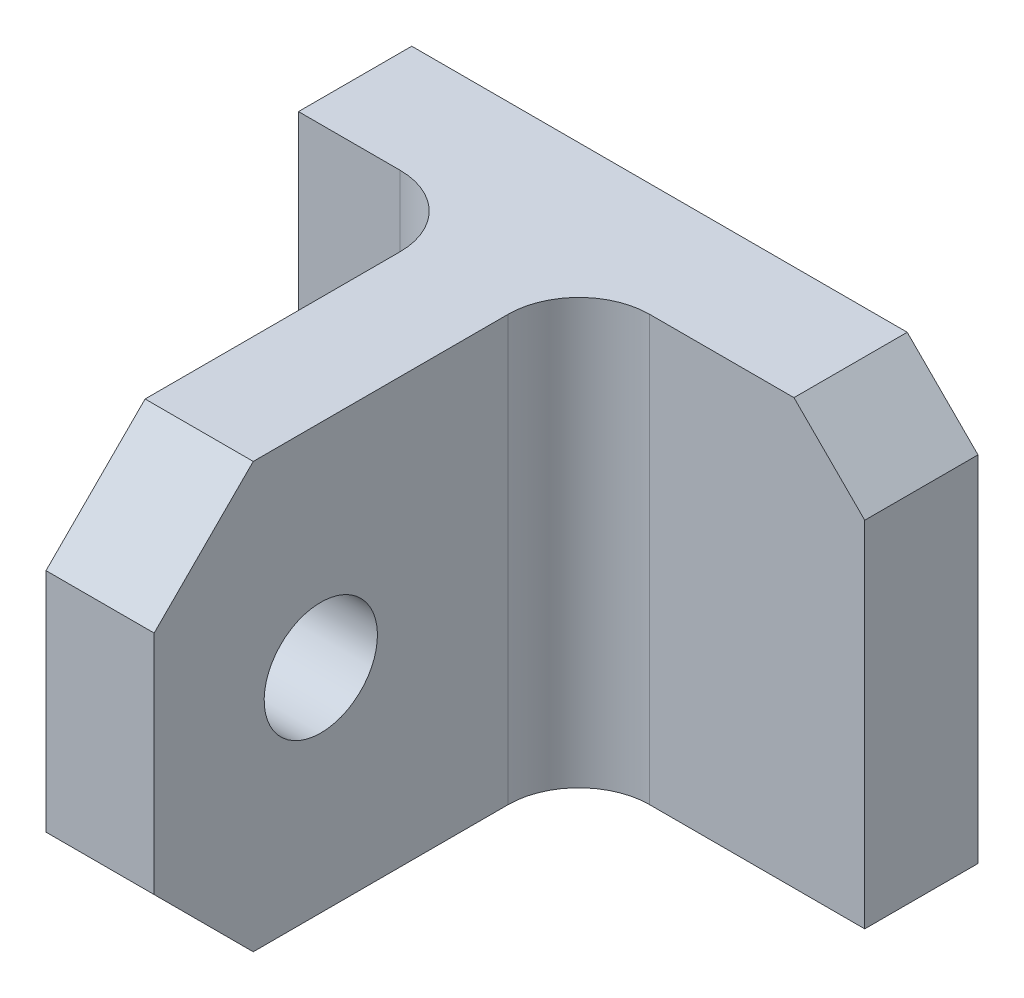
ISO-10303-21;
HEADER;
FILE_DESCRIPTION(('STEP AP214'),'2;1');
FILE_NAME('part.step','',(''),(''),'','','');
FILE_SCHEMA(('AUTOMOTIVE_DESIGN { 1 0 10303 214 1 1 1 1 }'));
ENDSEC;
DATA;
#1=APPLICATION_CONTEXT('core data for automotive mechanical design processes');
#2=APPLICATION_PROTOCOL_DEFINITION('international standard','automotive_design',2000,#1);
#3=PRODUCT_CONTEXT('',#1,'mechanical');
#4=PRODUCT('Part','Part','',(#3));
#5=PRODUCT_RELATED_PRODUCT_CATEGORY('part','',(#4));
#6=PRODUCT_DEFINITION_FORMATION('','',#4);
#7=PRODUCT_DEFINITION_CONTEXT('part definition',#1,'design');
#8=PRODUCT_DEFINITION('design','',#6,#7);
#9=PRODUCT_DEFINITION_SHAPE('','',#8);
#10=(LENGTH_UNIT() NAMED_UNIT(*) SI_UNIT(.MILLI.,.METRE.));
#11=(NAMED_UNIT(*) PLANE_ANGLE_UNIT() SI_UNIT($,.RADIAN.));
#12=(NAMED_UNIT(*) SI_UNIT($,.STERADIAN.) SOLID_ANGLE_UNIT());
#13=UNCERTAINTY_MEASURE_WITH_UNIT(LENGTH_MEASURE(1.E-05),#10,'distance_accuracy_value','');
#14=(GEOMETRIC_REPRESENTATION_CONTEXT(3) GLOBAL_UNCERTAINTY_ASSIGNED_CONTEXT((#13)) GLOBAL_UNIT_ASSIGNED_CONTEXT((#10,
#11,#12)) REPRESENTATION_CONTEXT('',''));
#15=CARTESIAN_POINT('',(0.,0.,0.));
#16=DIRECTION('',(0.,0.,1.));
#17=DIRECTION('',(1.,0.,0.));
#18=AXIS2_PLACEMENT_3D('',#15,#16,#17);
#19=CARTESIAN_POINT('',(-4.01563817115146,0.,30.));
#20=DIRECTION('',(1.,0.,0.));
#21=DIRECTION('',(0.,1.,0.));
#22=AXIS2_PLACEMENT_3D('',#19,#20,#21);
#23=PLANE('',#22);
#24=CARTESIAN_POINT('',(-4.01563817115146,-15.,18.2288416886326));
#25=DIRECTION('',(-1.,0.,0.));
#26=DIRECTION('',(0.,-1.,0.));
#27=AXIS2_PLACEMENT_3D('',#24,#25,#26);
#28=CIRCLE('',#27,4.);
#29=CARTESIAN_POINT('',(-4.01563817115146,-19.,18.2288416886326));
#30=VERTEX_POINT('',#29);
#31=EDGE_CURVE('E189',#30,#30,#28,.T.);
#32=ORIENTED_EDGE('',*,*,#31,.F.);
#33=EDGE_LOOP('',(#32));
#34=FACE_BOUND('',#33,.T.);
#35=DIRECTION('',(0.,0.,-1.));
#36=VECTOR('',#35,1.);
#37=CARTESIAN_POINT('',(-4.01563817115146,-30.,30.));
#38=LINE('',#37,#36);
#39=CARTESIAN_POINT('',(-4.01563817115146,-30.,23.));
#40=VERTEX_POINT('',#39);
#41=CARTESIAN_POINT('',(-4.01563817115146,-30.,5.));
#42=VERTEX_POINT('',#41);
#43=EDGE_CURVE('E229',#40,#42,#38,.T.);
#44=ORIENTED_EDGE('',*,*,#43,.F.);
#45=DIRECTION('',(0.,0.707106781186546,0.707106781186549));
#46=VECTOR('',#45,1.);
#47=CARTESIAN_POINT('',(-4.01563817115146,-23.,30.));
#48=LINE('',#47,#46);
#49=CARTESIAN_POINT('',(-4.01563817115146,-23.,30.));
#50=VERTEX_POINT('',#49);
#51=EDGE_CURVE('E207',#40,#50,#48,.T.);
#52=ORIENTED_EDGE('',*,*,#51,.T.);
#53=DIRECTION('',(0.,-1.,0.));
#54=VECTOR('',#53,1.);
#55=CARTESIAN_POINT('',(-4.01563817115146,0.,30.));
#56=LINE('',#55,#54);
#57=CARTESIAN_POINT('',(-4.01563817115146,-6.99999999999999,30.));
#58=VERTEX_POINT('',#57);
#59=EDGE_CURVE('E147',#58,#50,#56,.T.);
#60=ORIENTED_EDGE('',*,*,#59,.F.);
#61=DIRECTION('',(0.,0.707106781186546,-0.707106781186549));
#62=VECTOR('',#61,1.);
#63=CARTESIAN_POINT('',(-4.01563817115146,-7.,30.));
#64=LINE('',#63,#62);
#65=CARTESIAN_POINT('',(-4.01563817115146,0.,23.));
#66=VERTEX_POINT('',#65);
#67=EDGE_CURVE('E211',#58,#66,#64,.T.);
#68=ORIENTED_EDGE('',*,*,#67,.T.);
#69=DIRECTION('',(0.,0.,-1.));
#70=VECTOR('',#69,1.);
#71=CARTESIAN_POINT('',(-4.01563817115146,0.,30.));
#72=LINE('',#71,#70);
#73=CARTESIAN_POINT('',(-4.01563817115146,0.,5.));
#74=VERTEX_POINT('',#73);
#75=EDGE_CURVE('E219',#66,#74,#72,.T.);
#76=ORIENTED_EDGE('',*,*,#75,.T.);
#77=DIRECTION('',(0.,-1.,0.));
#78=VECTOR('',#77,1.);
#79=CARTESIAN_POINT('',(-4.01563817115146,0.,5.));
#80=LINE('',#79,#78);
#81=EDGE_CURVE('E171',#74,#42,#80,.T.);
#82=ORIENTED_EDGE('',*,*,#81,.T.);
#83=EDGE_LOOP('',(#44,#52,#60,#68,#76,#82));
#84=FACE_BOUND('',#83,.T.);
#85=ADVANCED_FACE('F31',(#34,#84),#23,.F.);
#86=CARTESIAN_POINT('',(-4.01563817115146,-30.,30.));
#87=DIRECTION('',(0.,1.,0.));
#88=DIRECTION('',(0.,0.,1.));
#89=AXIS2_PLACEMENT_3D('',#86,#87,#88);
#90=PLANE('',#89);
#91=DIRECTION('',(0.,0.,-1.));
#92=VECTOR('',#91,1.);
#93=CARTESIAN_POINT('',(3.62436182884854,-30.,30.));
#94=LINE('',#93,#92);
#95=CARTESIAN_POINT('',(3.62436182884854,-30.,23.));
#96=VERTEX_POINT('',#95);
#97=CARTESIAN_POINT('',(3.62436182884854,-30.,5.));
#98=VERTEX_POINT('',#97);
#99=EDGE_CURVE('E231',#96,#98,#94,.T.);
#100=ORIENTED_EDGE('',*,*,#99,.F.);
#101=DIRECTION('',(-1.,0.,0.));
#102=VECTOR('',#101,1.);
#103=CARTESIAN_POINT('',(-4.01563817115146,-30.,23.));
#104=LINE('',#103,#102);
#105=EDGE_CURVE('E216',#96,#40,#104,.T.);
#106=ORIENTED_EDGE('',*,*,#105,.T.);
#107=ORIENTED_EDGE('',*,*,#43,.T.);
#108=CARTESIAN_POINT('',(-9.01563817115146,-30.,5.));
#109=DIRECTION('',(0.,1.,0.));
#110=DIRECTION('',(0.,0.,1.));
#111=AXIS2_PLACEMENT_3D('',#108,#109,#110);
#112=CIRCLE('',#111,5.);
#113=CARTESIAN_POINT('',(-9.01563817115146,-29.9999999923037,0.));
#114=VERTEX_POINT('',#113);
#115=EDGE_CURVE('E263',#42,#114,#112,.T.);
#116=ORIENTED_EDGE('',*,*,#115,.T.);
#117=DIRECTION('',(-1.,0.,0.));
#118=VECTOR('',#117,1.);
#119=CARTESIAN_POINT('',(23.82,-29.9999999923037,0.));
#120=LINE('',#119,#118);
#121=CARTESIAN_POINT('',(-16.18,-29.9999999923037,0.));
#122=VERTEX_POINT('',#121);
#123=EDGE_CURVE('E161',#114,#122,#120,.T.);
#124=ORIENTED_EDGE('',*,*,#123,.T.);
#125=DIRECTION('',(0.,0.,1.));
#126=VECTOR('',#125,1.);
#127=CARTESIAN_POINT('',(-16.18,-29.9999999923037,-8.));
#128=LINE('',#127,#126);
#129=CARTESIAN_POINT('',(-16.18,-29.9999999923037,-8.));
#130=VERTEX_POINT('',#129);
#131=EDGE_CURVE('E154',#130,#122,#128,.T.);
#132=ORIENTED_EDGE('',*,*,#131,.F.);
#133=DIRECTION('',(-1.,0.,0.));
#134=VECTOR('',#133,1.);
#135=CARTESIAN_POINT('',(23.82,-29.9999999923037,-8.));
#136=LINE('',#135,#134);
#137=CARTESIAN_POINT('',(23.82,-29.9999999923037,-8.));
#138=VERTEX_POINT('',#137);
#139=EDGE_CURVE('E138',#138,#130,#136,.T.);
#140=ORIENTED_EDGE('',*,*,#139,.F.);
#141=DIRECTION('',(0.,0.,1.));
#142=VECTOR('',#141,1.);
#143=CARTESIAN_POINT('',(23.82,-29.9999999923037,-8.));
#144=LINE('',#143,#142);
#145=CARTESIAN_POINT('',(23.82,-29.9999999923037,0.));
#146=VERTEX_POINT('',#145);
#147=EDGE_CURVE('E148',#138,#146,#144,.T.);
#148=ORIENTED_EDGE('',*,*,#147,.T.);
#149=CARTESIAN_POINT('',(8.62436182884854,-29.9999999923037,0.));
#150=VERTEX_POINT('',#149);
#151=EDGE_CURVE('E142',#146,#150,#120,.T.);
#152=ORIENTED_EDGE('',*,*,#151,.T.);
#153=CARTESIAN_POINT('',(8.62436182884854,-30.,5.));
#154=DIRECTION('',(0.,1.,0.));
#155=DIRECTION('',(0.,0.,1.));
#156=AXIS2_PLACEMENT_3D('',#153,#154,#155);
#157=CIRCLE('',#156,5.);
#158=EDGE_CURVE('E254',#150,#98,#157,.T.);
#159=ORIENTED_EDGE('',*,*,#158,.T.);
#160=EDGE_LOOP('',(#100,#106,#107,#116,#124,#132,#140,#148,#152,#159));
#161=FACE_BOUND('',#160,.T.);
#162=ADVANCED_FACE('F274',(#161),#90,.F.);
#163=CARTESIAN_POINT('',(3.62436182884854,0.,30.));
#164=DIRECTION('',(-1.,0.,0.));
#165=DIRECTION('',(0.,-1.,0.));
#166=AXIS2_PLACEMENT_3D('',#163,#164,#165);
#167=PLANE('',#166);
#168=CARTESIAN_POINT('',(3.62436182884853,-15.,18.2288416886326));
#169=DIRECTION('',(-1.,0.,0.));
#170=DIRECTION('',(0.,-1.,0.));
#171=AXIS2_PLACEMENT_3D('',#168,#169,#170);
#172=CIRCLE('',#171,4.);
#173=CARTESIAN_POINT('',(3.62436182884854,-19.,18.2288416886326));
#174=VERTEX_POINT('',#173);
#175=EDGE_CURVE('E186',#174,#174,#172,.T.);
#176=ORIENTED_EDGE('',*,*,#175,.T.);
#177=EDGE_LOOP('',(#176));
#178=FACE_BOUND('',#177,.T.);
#179=DIRECTION('',(0.,1.,0.));
#180=VECTOR('',#179,1.);
#181=CARTESIAN_POINT('',(3.62436182884854,0.,30.));
#182=LINE('',#181,#180);
#183=CARTESIAN_POINT('',(3.62436182884854,-23.,30.));
#184=VERTEX_POINT('',#183);
#185=CARTESIAN_POINT('',(3.62436182884854,-6.99999999999999,30.));
#186=VERTEX_POINT('',#185);
#187=EDGE_CURVE('E151',#184,#186,#182,.T.);
#188=ORIENTED_EDGE('',*,*,#187,.F.);
#189=DIRECTION('',(0.,-0.707106781186546,-0.707106781186549));
#190=VECTOR('',#189,1.);
#191=CARTESIAN_POINT('',(3.62436182884854,-23.,30.));
#192=LINE('',#191,#190);
#193=EDGE_CURVE('E232',#184,#96,#192,.T.);
#194=ORIENTED_EDGE('',*,*,#193,.T.);
#195=ORIENTED_EDGE('',*,*,#99,.T.);
#196=DIRECTION('',(0.,1.,0.));
#197=VECTOR('',#196,1.);
#198=CARTESIAN_POINT('',(3.62436182884854,0.,5.));
#199=LINE('',#198,#197);
#200=CARTESIAN_POINT('',(3.62436182884854,0.,5.));
#201=VERTEX_POINT('',#200);
#202=EDGE_CURVE('E175',#98,#201,#199,.T.);
#203=ORIENTED_EDGE('',*,*,#202,.T.);
#204=DIRECTION('',(0.,0.,-1.));
#205=VECTOR('',#204,1.);
#206=CARTESIAN_POINT('',(3.62436182884854,0.,30.));
#207=LINE('',#206,#205);
#208=CARTESIAN_POINT('',(3.62436182884854,0.,23.));
#209=VERTEX_POINT('',#208);
#210=EDGE_CURVE('E221',#209,#201,#207,.T.);
#211=ORIENTED_EDGE('',*,*,#210,.F.);
#212=DIRECTION('',(0.,-0.707106781186546,0.707106781186549));
#213=VECTOR('',#212,1.);
#214=CARTESIAN_POINT('',(3.62436182884854,-6.99999999999999,30.));
#215=LINE('',#214,#213);
#216=EDGE_CURVE('E234',#209,#186,#215,.T.);
#217=ORIENTED_EDGE('',*,*,#216,.T.);
#218=EDGE_LOOP('',(#188,#194,#195,#203,#211,#217));
#219=FACE_BOUND('',#218,.T.);
#220=ADVANCED_FACE('F278',(#178,#219),#167,.F.);
#221=CARTESIAN_POINT('',(-4.01563817115146,0.,30.));
#222=DIRECTION('',(0.,-1.,0.));
#223=DIRECTION('',(0.,0.,-1.));
#224=AXIS2_PLACEMENT_3D('',#221,#222,#223);
#225=PLANE('',#224);
#226=DIRECTION('',(1.,0.,0.));
#227=VECTOR('',#226,1.);
#228=CARTESIAN_POINT('',(23.82,-6.81641941867636E-12,0.));
#229=LINE('',#228,#227);
#230=CARTESIAN_POINT('',(8.62436182884854,-6.81641941867636E-12,0.));
#231=VERTEX_POINT('',#230);
#232=CARTESIAN_POINT('',(18.8199999999931,-6.81641941867636E-12,0.));
#233=VERTEX_POINT('',#232);
#234=EDGE_CURVE('E179',#231,#233,#229,.T.);
#235=ORIENTED_EDGE('',*,*,#234,.T.);
#236=DIRECTION('',(0.,0.,-1.));
#237=VECTOR('',#236,1.);
#238=CARTESIAN_POINT('',(18.8199999999931,0.,30.));
#239=LINE('',#238,#237);
#240=CARTESIAN_POINT('',(18.82,-6.81607397789462E-12,-8.));
#241=VERTEX_POINT('',#240);
#242=EDGE_CURVE('E39',#233,#241,#239,.T.);
#243=ORIENTED_EDGE('',*,*,#242,.T.);
#244=DIRECTION('',(1.,0.,0.));
#245=VECTOR('',#244,1.);
#246=CARTESIAN_POINT('',(23.82,-6.81641941867636E-12,-8.));
#247=LINE('',#246,#245);
#248=CARTESIAN_POINT('',(-16.18,-6.81641941867636E-12,-8.));
#249=VERTEX_POINT('',#248);
#250=EDGE_CURVE('E123',#249,#241,#247,.T.);
#251=ORIENTED_EDGE('',*,*,#250,.F.);
#252=DIRECTION('',(0.,0.,1.));
#253=VECTOR('',#252,1.);
#254=CARTESIAN_POINT('',(-16.18,-6.81641941867636E-12,-8.));
#255=LINE('',#254,#253);
#256=CARTESIAN_POINT('',(-16.18,-6.81641941867636E-12,0.));
#257=VERTEX_POINT('',#256);
#258=EDGE_CURVE('E128',#249,#257,#255,.T.);
#259=ORIENTED_EDGE('',*,*,#258,.T.);
#260=CARTESIAN_POINT('',(-9.01563817115146,-6.81641941867636E-12,0.));
#261=VERTEX_POINT('',#260);
#262=EDGE_CURVE('E162',#257,#261,#229,.T.);
#263=ORIENTED_EDGE('',*,*,#262,.T.);
#264=CARTESIAN_POINT('',(-9.01563817115146,0.,5.));
#265=DIRECTION('',(0.,-1.,0.));
#266=DIRECTION('',(0.,0.,-1.));
#267=AXIS2_PLACEMENT_3D('',#264,#265,#266);
#268=CIRCLE('',#267,5.);
#269=EDGE_CURVE('E261',#261,#74,#268,.T.);
#270=ORIENTED_EDGE('',*,*,#269,.T.);
#271=ORIENTED_EDGE('',*,*,#75,.F.);
#272=DIRECTION('',(1.,0.,0.));
#273=VECTOR('',#272,1.);
#274=CARTESIAN_POINT('',(3.62436182884854,0.,23.));
#275=LINE('',#274,#273);
#276=EDGE_CURVE('E199',#66,#209,#275,.T.);
#277=ORIENTED_EDGE('',*,*,#276,.T.);
#278=ORIENTED_EDGE('',*,*,#210,.T.);
#279=CARTESIAN_POINT('',(8.62436182884854,0.,5.));
#280=DIRECTION('',(0.,-1.,0.));
#281=DIRECTION('',(0.,0.,-1.));
#282=AXIS2_PLACEMENT_3D('',#279,#280,#281);
#283=CIRCLE('',#282,5.);
#284=EDGE_CURVE('E257',#201,#231,#283,.T.);
#285=ORIENTED_EDGE('',*,*,#284,.T.);
#286=EDGE_LOOP('',(#235,#243,#251,#259,#263,#270,#271,#277,#278,#285));
#287=FACE_BOUND('',#286,.T.);
#288=ADVANCED_FACE('F125',(#287),#225,.F.);
#289=CARTESIAN_POINT('',(-4.01563817115146,-30.,30.));
#290=DIRECTION('',(0.,0.,1.));
#291=DIRECTION('',(1.,0.,0.));
#292=AXIS2_PLACEMENT_3D('',#289,#290,#291);
#293=PLANE('',#292);
#294=ORIENTED_EDGE('',*,*,#59,.T.);
#295=DIRECTION('',(1.,0.,0.));
#296=VECTOR('',#295,1.);
#297=CARTESIAN_POINT('',(3.62436182884854,-23.,30.));
#298=LINE('',#297,#296);
#299=EDGE_CURVE('E236',#50,#184,#298,.T.);
#300=ORIENTED_EDGE('',*,*,#299,.T.);
#301=ORIENTED_EDGE('',*,*,#187,.T.);
#302=DIRECTION('',(-1.,0.,0.));
#303=VECTOR('',#302,1.);
#304=CARTESIAN_POINT('',(-4.01563817115146,-7.,30.));
#305=LINE('',#304,#303);
#306=EDGE_CURVE('E248',#186,#58,#305,.T.);
#307=ORIENTED_EDGE('',*,*,#306,.T.);
#308=EDGE_LOOP('',(#294,#300,#301,#307));
#309=FACE_BOUND('',#308,.T.);
#310=ADVANCED_FACE('F247',(#309),#293,.T.);
#311=CARTESIAN_POINT('',(-16.18,-6.81641941867636E-12,0.));
#312=DIRECTION('',(0.,0.,1.));
#313=DIRECTION('',(1.,0.,0.));
#314=AXIS2_PLACEMENT_3D('',#311,#312,#313);
#315=PLANE('',#314);
#316=ORIENTED_EDGE('',*,*,#123,.F.);
#317=DIRECTION('',(0.,-1.,0.));
#318=VECTOR('',#317,1.);
#319=CARTESIAN_POINT('',(-9.01563817115146,-6.81559087289937E-12,0.));
#320=LINE('',#319,#318);
#321=EDGE_CURVE('E173',#114,#261,#320,.F.);
#322=ORIENTED_EDGE('',*,*,#321,.T.);
#323=ORIENTED_EDGE('',*,*,#262,.F.);
#324=DIRECTION('',(0.,1.,0.));
#325=VECTOR('',#324,1.);
#326=CARTESIAN_POINT('',(-16.18,-29.9999999923037,0.));
#327=LINE('',#326,#325);
#328=EDGE_CURVE('E146',#122,#257,#327,.T.);
#329=ORIENTED_EDGE('',*,*,#328,.F.);
#330=EDGE_LOOP('',(#316,#322,#323,#329));
#331=FACE_BOUND('',#330,.T.);
#332=ADVANCED_FACE('F312',(#331),#315,.T.);
#333=DIRECTION('',(0.,-1.,0.));
#334=VECTOR('',#333,1.);
#335=CARTESIAN_POINT('',(23.82,-29.9999999923037,0.));
#336=LINE('',#335,#334);
#337=CARTESIAN_POINT('',(23.82,-5.00000000000683,0.));
#338=VERTEX_POINT('',#337);
#339=EDGE_CURVE('E166',#338,#146,#336,.T.);
#340=ORIENTED_EDGE('',*,*,#339,.F.);
#341=DIRECTION('',(0.707106781186549,-0.707106781186546,0.));
#342=VECTOR('',#341,1.);
#343=CARTESIAN_POINT('',(1.31999999999993,17.4999999999932,0.));
#344=LINE('',#343,#342);
#345=EDGE_CURVE('E53',#338,#233,#344,.F.);
#346=ORIENTED_EDGE('',*,*,#345,.T.);
#347=ORIENTED_EDGE('',*,*,#234,.F.);
#348=DIRECTION('',(0.,1.,0.));
#349=VECTOR('',#348,1.);
#350=CARTESIAN_POINT('',(8.62436182884854,-6.81355083809162E-12,0.));
#351=LINE('',#350,#349);
#352=EDGE_CURVE('E178',#231,#150,#351,.F.);
#353=ORIENTED_EDGE('',*,*,#352,.T.);
#354=ORIENTED_EDGE('',*,*,#151,.F.);
#355=EDGE_LOOP('',(#340,#346,#347,#353,#354));
#356=FACE_BOUND('',#355,.T.);
#357=ADVANCED_FACE('F269',(#356),#315,.T.);
#358=CARTESIAN_POINT('',(-16.18,-29.9999999923037,-8.));
#359=DIRECTION('',(1.,0.,0.));
#360=DIRECTION('',(0.,0.,-1.));
#361=AXIS2_PLACEMENT_3D('',#358,#359,#360);
#362=PLANE('',#361);
#363=ORIENTED_EDGE('',*,*,#328,.T.);
#364=ORIENTED_EDGE('',*,*,#258,.F.);
#365=DIRECTION('',(0.,1.,0.));
#366=VECTOR('',#365,1.);
#367=CARTESIAN_POINT('',(-16.18,-29.9999999923037,-8.));
#368=LINE('',#367,#366);
#369=EDGE_CURVE('E133',#130,#249,#368,.T.);
#370=ORIENTED_EDGE('',*,*,#369,.F.);
#371=ORIENTED_EDGE('',*,*,#131,.T.);
#372=EDGE_LOOP('',(#363,#364,#370,#371));
#373=FACE_BOUND('',#372,.T.);
#374=ADVANCED_FACE('F144',(#373),#362,.F.);
#375=CARTESIAN_POINT('',(23.82,-29.9999999923037,-8.));
#376=DIRECTION('',(-1.,0.,0.));
#377=DIRECTION('',(0.,0.,1.));
#378=AXIS2_PLACEMENT_3D('',#375,#376,#377);
#379=PLANE('',#378);
#380=DIRECTION('',(0.,-1.,0.));
#381=VECTOR('',#380,1.);
#382=CARTESIAN_POINT('',(23.82,-29.9999999923037,-8.));
#383=LINE('',#382,#381);
#384=CARTESIAN_POINT('',(23.82,-5.00000000000683,-8.));
#385=VERTEX_POINT('',#384);
#386=EDGE_CURVE('E132',#385,#138,#383,.T.);
#387=ORIENTED_EDGE('',*,*,#386,.F.);
#388=DIRECTION('',(0.,0.,1.));
#389=VECTOR('',#388,1.);
#390=CARTESIAN_POINT('',(23.82,-5.00000000000682,-8.));
#391=LINE('',#390,#389);
#392=EDGE_CURVE('E201',#385,#338,#391,.T.);
#393=ORIENTED_EDGE('',*,*,#392,.T.);
#394=ORIENTED_EDGE('',*,*,#339,.T.);
#395=ORIENTED_EDGE('',*,*,#147,.F.);
#396=EDGE_LOOP('',(#387,#393,#394,#395));
#397=FACE_BOUND('',#396,.T.);
#398=ADVANCED_FACE('F305',(#397),#379,.F.);
#399=CARTESIAN_POINT('',(-16.18,-6.81641941867636E-12,-8.));
#400=DIRECTION('',(0.,0.,1.));
#401=DIRECTION('',(1.,0.,0.));
#402=AXIS2_PLACEMENT_3D('',#399,#400,#401);
#403=PLANE('',#402);
#404=ORIENTED_EDGE('',*,*,#250,.T.);
#405=DIRECTION('',(-0.707106781186549,0.707106781186546,0.));
#406=VECTOR('',#405,1.);
#407=CARTESIAN_POINT('',(23.82,-5.00000000000682,-8.));
#408=LINE('',#407,#406);
#409=EDGE_CURVE('E11',#241,#385,#408,.F.);
#410=ORIENTED_EDGE('',*,*,#409,.T.);
#411=ORIENTED_EDGE('',*,*,#386,.T.);
#412=ORIENTED_EDGE('',*,*,#139,.T.);
#413=ORIENTED_EDGE('',*,*,#369,.T.);
#414=EDGE_LOOP('',(#404,#410,#411,#412,#413));
#415=FACE_BOUND('',#414,.T.);
#416=ADVANCED_FACE('F136',(#415),#403,.F.);
#417=CARTESIAN_POINT('',(-9.01563817115146,0.,5.));
#418=DIRECTION('',(0.,-1.,0.));
#419=DIRECTION('',(1.,0.,0.));
#420=AXIS2_PLACEMENT_3D('',#417,#418,#419);
#421=CYLINDRICAL_SURFACE('',#420,5.);
#422=ORIENTED_EDGE('',*,*,#269,.F.);
#423=ORIENTED_EDGE('',*,*,#321,.F.);
#424=ORIENTED_EDGE('',*,*,#115,.F.);
#425=ORIENTED_EDGE('',*,*,#81,.F.);
#426=EDGE_LOOP('',(#422,#423,#424,#425));
#427=FACE_BOUND('',#426,.T.);
#428=ADVANCED_FACE('F289',(#427),#421,.F.);
#429=CARTESIAN_POINT('',(8.62436182884854,0.,5.));
#430=DIRECTION('',(0.,1.,0.));
#431=DIRECTION('',(-1.,0.,0.));
#432=AXIS2_PLACEMENT_3D('',#429,#430,#431);
#433=CYLINDRICAL_SURFACE('',#432,5.);
#434=ORIENTED_EDGE('',*,*,#158,.F.);
#435=ORIENTED_EDGE('',*,*,#352,.F.);
#436=ORIENTED_EDGE('',*,*,#284,.F.);
#437=ORIENTED_EDGE('',*,*,#202,.F.);
#438=EDGE_LOOP('',(#434,#435,#436,#437));
#439=FACE_BOUND('',#438,.T.);
#440=ADVANCED_FACE('F277',(#439),#433,.F.);
#441=CARTESIAN_POINT('',(-4.01563817115146,-23.,30.));
#442=DIRECTION('',(0.,-0.707106781186549,0.707106781186546));
#443=DIRECTION('',(0.,-0.707106781186546,-0.707106781186549));
#444=AXIS2_PLACEMENT_3D('',#441,#442,#443);
#445=PLANE('',#444);
#446=ORIENTED_EDGE('',*,*,#51,.F.);
#447=ORIENTED_EDGE('',*,*,#105,.F.);
#448=ORIENTED_EDGE('',*,*,#193,.F.);
#449=ORIENTED_EDGE('',*,*,#299,.F.);
#450=EDGE_LOOP('',(#446,#447,#448,#449));
#451=FACE_BOUND('',#450,.T.);
#452=ADVANCED_FACE('F281',(#451),#445,.T.);
#453=CARTESIAN_POINT('',(-4.01563817115146,-7.,30.));
#454=DIRECTION('',(0.,0.707106781186549,0.707106781186546));
#455=DIRECTION('',(0.,-0.707106781186546,0.707106781186549));
#456=AXIS2_PLACEMENT_3D('',#453,#454,#455);
#457=PLANE('',#456);
#458=ORIENTED_EDGE('',*,*,#216,.F.);
#459=ORIENTED_EDGE('',*,*,#276,.F.);
#460=ORIENTED_EDGE('',*,*,#67,.F.);
#461=ORIENTED_EDGE('',*,*,#306,.F.);
#462=EDGE_LOOP('',(#458,#459,#460,#461));
#463=FACE_BOUND('',#462,.T.);
#464=ADVANCED_FACE('F253',(#463),#457,.T.);
#465=CARTESIAN_POINT('',(23.82,-15.,18.2288416886326));
#466=DIRECTION('',(-1.,0.,0.));
#467=DIRECTION('',(0.,-1.,0.));
#468=AXIS2_PLACEMENT_3D('',#465,#466,#467);
#469=CYLINDRICAL_SURFACE('',#468,4.);
#470=ORIENTED_EDGE('',*,*,#31,.T.);
#471=EDGE_LOOP('',(#470));
#472=FACE_BOUND('',#471,.T.);
#473=ORIENTED_EDGE('',*,*,#175,.F.);
#474=EDGE_LOOP('',(#473));
#475=FACE_BOUND('',#474,.T.);
#476=ADVANCED_FACE('F288',(#472,#475),#469,.F.);
#477=CARTESIAN_POINT('',(23.82,-5.00000000000682,-8.));
#478=DIRECTION('',(-0.707106781186546,-0.707106781186549,0.));
#479=DIRECTION('',(0.707106781186549,-0.707106781186546,0.));
#480=AXIS2_PLACEMENT_3D('',#477,#478,#479);
#481=PLANE('',#480);
#482=ORIENTED_EDGE('',*,*,#409,.F.);
#483=ORIENTED_EDGE('',*,*,#242,.F.);
#484=ORIENTED_EDGE('',*,*,#345,.F.);
#485=ORIENTED_EDGE('',*,*,#392,.F.);
#486=EDGE_LOOP('',(#482,#483,#484,#485));
#487=FACE_BOUND('',#486,.T.);
#488=ADVANCED_FACE('F33',(#487),#481,.F.);
#489=CLOSED_SHELL('',(#85,#162,#220,#288,#310,#332,#357,#374,#398,#416,#428,#440,#452,#464,#476,#488));
#490=MANIFOLD_SOLID_BREP('B2',#489);
#491=ADVANCED_BREP_SHAPE_REPRESENTATION('',(#18,#490),#14);
#492=SHAPE_DEFINITION_REPRESENTATION(#9,#491);
ENDSEC;
END-ISO-10303-21;
